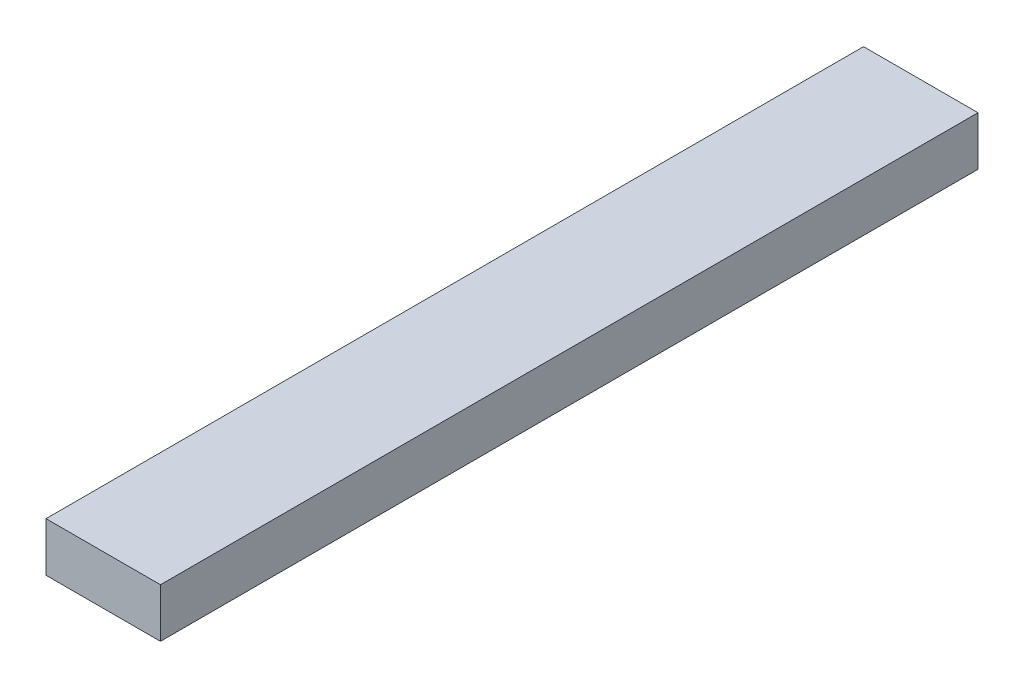
ISO-10303-21;
HEADER;
FILE_DESCRIPTION(('STEP AP214'),'2;1');
FILE_NAME('part.step','',(''),(''),'','','');
FILE_SCHEMA(('AUTOMOTIVE_DESIGN { 1 0 10303 214 1 1 1 1 }'));
ENDSEC;
DATA;
#1=APPLICATION_CONTEXT('core data for automotive mechanical design processes');
#2=APPLICATION_PROTOCOL_DEFINITION('international standard','automotive_design',2000,#1);
#3=PRODUCT_CONTEXT('',#1,'mechanical');
#4=PRODUCT('Part','Part','',(#3));
#5=PRODUCT_RELATED_PRODUCT_CATEGORY('part','',(#4));
#6=PRODUCT_DEFINITION_FORMATION('','',#4);
#7=PRODUCT_DEFINITION_CONTEXT('part definition',#1,'design');
#8=PRODUCT_DEFINITION('design','',#6,#7);
#9=PRODUCT_DEFINITION_SHAPE('','',#8);
#10=(LENGTH_UNIT() NAMED_UNIT(*) SI_UNIT(.MILLI.,.METRE.));
#11=(NAMED_UNIT(*) PLANE_ANGLE_UNIT() SI_UNIT($,.RADIAN.));
#12=(NAMED_UNIT(*) SI_UNIT($,.STERADIAN.) SOLID_ANGLE_UNIT());
#13=UNCERTAINTY_MEASURE_WITH_UNIT(LENGTH_MEASURE(1.E-05),#10,'distance_accuracy_value','');
#14=(GEOMETRIC_REPRESENTATION_CONTEXT(3) GLOBAL_UNCERTAINTY_ASSIGNED_CONTEXT((#13)) GLOBAL_UNIT_ASSIGNED_CONTEXT((#10,
#11,#12)) REPRESENTATION_CONTEXT('',''));
#15=CARTESIAN_POINT('',(0.,0.,0.));
#16=DIRECTION('',(0.,0.,1.));
#17=DIRECTION('',(1.,0.,0.));
#18=AXIS2_PLACEMENT_3D('',#15,#16,#17);
#19=CARTESIAN_POINT('',(0.,0.,635.));
#20=DIRECTION('',(1.,0.,0.));
#21=DIRECTION('',(0.,1.,0.));
#22=AXIS2_PLACEMENT_3D('',#19,#20,#21);
#23=PLANE('',#22);
#24=DIRECTION('',(0.,-1.,0.));
#25=VECTOR('',#24,1.);
#26=CARTESIAN_POINT('',(0.,0.,0.));
#27=LINE('',#26,#25);
#28=CARTESIAN_POINT('',(0.,0.,0.));
#29=VERTEX_POINT('',#28);
#30=CARTESIAN_POINT('',(0.,-38.1,0.));
#31=VERTEX_POINT('',#30);
#32=EDGE_CURVE('E96',#29,#31,#27,.T.);
#33=ORIENTED_EDGE('',*,*,#32,.T.);
#34=DIRECTION('',(0.,0.,-1.));
#35=VECTOR('',#34,1.);
#36=CARTESIAN_POINT('',(0.,-38.1,635.));
#37=LINE('',#36,#35);
#38=CARTESIAN_POINT('',(0.,-38.1,635.));
#39=VERTEX_POINT('',#38);
#40=EDGE_CURVE('E11',#39,#31,#37,.T.);
#41=ORIENTED_EDGE('',*,*,#40,.F.);
#42=DIRECTION('',(0.,-1.,0.));
#43=VECTOR('',#42,1.);
#44=CARTESIAN_POINT('',(0.,0.,635.));
#45=LINE('',#44,#43);
#46=CARTESIAN_POINT('',(0.,0.,635.));
#47=VERTEX_POINT('',#46);
#48=EDGE_CURVE('E84',#47,#39,#45,.T.);
#49=ORIENTED_EDGE('',*,*,#48,.F.);
#50=DIRECTION('',(0.,0.,-1.));
#51=VECTOR('',#50,1.);
#52=CARTESIAN_POINT('',(0.,0.,635.));
#53=LINE('',#52,#51);
#54=EDGE_CURVE('E92',#47,#29,#53,.T.);
#55=ORIENTED_EDGE('',*,*,#54,.T.);
#56=EDGE_LOOP('',(#33,#41,#49,#55));
#57=FACE_BOUND('',#56,.T.);
#58=ADVANCED_FACE('F33',(#57),#23,.F.);
#59=CARTESIAN_POINT('',(0.,-38.1,635.));
#60=DIRECTION('',(0.,1.,0.));
#61=DIRECTION('',(0.,0.,1.));
#62=AXIS2_PLACEMENT_3D('',#59,#60,#61);
#63=PLANE('',#62);
#64=DIRECTION('',(1.,0.,0.));
#65=VECTOR('',#64,1.);
#66=CARTESIAN_POINT('',(0.,-38.1,0.));
#67=LINE('',#66,#65);
#68=CARTESIAN_POINT('',(88.9,-38.1,0.));
#69=VERTEX_POINT('',#68);
#70=EDGE_CURVE('E88',#31,#69,#67,.T.);
#71=ORIENTED_EDGE('',*,*,#70,.T.);
#72=DIRECTION('',(0.,0.,-1.));
#73=VECTOR('',#72,1.);
#74=CARTESIAN_POINT('',(88.9,-38.1,635.));
#75=LINE('',#74,#73);
#76=CARTESIAN_POINT('',(88.9,-38.1,635.));
#77=VERTEX_POINT('',#76);
#78=EDGE_CURVE('E41',#77,#69,#75,.T.);
#79=ORIENTED_EDGE('',*,*,#78,.F.);
#80=DIRECTION('',(1.,0.,0.));
#81=VECTOR('',#80,1.);
#82=CARTESIAN_POINT('',(0.,-38.1,635.));
#83=LINE('',#82,#81);
#84=EDGE_CURVE('E79',#39,#77,#83,.T.);
#85=ORIENTED_EDGE('',*,*,#84,.F.);
#86=ORIENTED_EDGE('',*,*,#40,.T.);
#87=EDGE_LOOP('',(#71,#79,#85,#86));
#88=FACE_BOUND('',#87,.T.);
#89=ADVANCED_FACE('F87',(#88),#63,.F.);
#90=CARTESIAN_POINT('',(88.9,0.,635.));
#91=DIRECTION('',(-1.,0.,0.));
#92=DIRECTION('',(0.,0.,1.));
#93=AXIS2_PLACEMENT_3D('',#90,#91,#92);
#94=PLANE('',#93);
#95=DIRECTION('',(0.,1.,0.));
#96=VECTOR('',#95,1.);
#97=CARTESIAN_POINT('',(88.9,0.,0.));
#98=LINE('',#97,#96);
#99=CARTESIAN_POINT('',(88.9,0.,0.));
#100=VERTEX_POINT('',#99);
#101=EDGE_CURVE('E66',#69,#100,#98,.T.);
#102=ORIENTED_EDGE('',*,*,#101,.T.);
#103=DIRECTION('',(0.,0.,-1.));
#104=VECTOR('',#103,1.);
#105=CARTESIAN_POINT('',(88.9,0.,635.));
#106=LINE('',#105,#104);
#107=CARTESIAN_POINT('',(88.9,0.,635.));
#108=VERTEX_POINT('',#107);
#109=EDGE_CURVE('E89',#108,#100,#106,.T.);
#110=ORIENTED_EDGE('',*,*,#109,.F.);
#111=DIRECTION('',(0.,1.,0.));
#112=VECTOR('',#111,1.);
#113=CARTESIAN_POINT('',(88.9,0.,635.));
#114=LINE('',#113,#112);
#115=EDGE_CURVE('E82',#77,#108,#114,.T.);
#116=ORIENTED_EDGE('',*,*,#115,.F.);
#117=ORIENTED_EDGE('',*,*,#78,.T.);
#118=EDGE_LOOP('',(#102,#110,#116,#117));
#119=FACE_BOUND('',#118,.T.);
#120=ADVANCED_FACE('F90',(#119),#94,.F.);
#121=CARTESIAN_POINT('',(0.,0.,635.));
#122=DIRECTION('',(0.,-1.,0.));
#123=DIRECTION('',(0.,0.,-1.));
#124=AXIS2_PLACEMENT_3D('',#121,#122,#123);
#125=PLANE('',#124);
#126=DIRECTION('',(-1.,0.,0.));
#127=VECTOR('',#126,1.);
#128=CARTESIAN_POINT('',(0.,0.,0.));
#129=LINE('',#128,#127);
#130=EDGE_CURVE('E72',#100,#29,#129,.T.);
#131=ORIENTED_EDGE('',*,*,#130,.T.);
#132=ORIENTED_EDGE('',*,*,#54,.F.);
#133=DIRECTION('',(-1.,0.,0.));
#134=VECTOR('',#133,1.);
#135=CARTESIAN_POINT('',(0.,0.,635.));
#136=LINE('',#135,#134);
#137=EDGE_CURVE('E49',#108,#47,#136,.T.);
#138=ORIENTED_EDGE('',*,*,#137,.F.);
#139=ORIENTED_EDGE('',*,*,#109,.T.);
#140=EDGE_LOOP('',(#131,#132,#138,#139));
#141=FACE_BOUND('',#140,.T.);
#142=ADVANCED_FACE('F103',(#141),#125,.F.);
#143=CARTESIAN_POINT('',(0.,0.,635.));
#144=DIRECTION('',(0.,0.,1.));
#145=DIRECTION('',(1.,0.,0.));
#146=AXIS2_PLACEMENT_3D('',#143,#144,#145);
#147=PLANE('',#146);
#148=ORIENTED_EDGE('',*,*,#48,.T.);
#149=ORIENTED_EDGE('',*,*,#84,.T.);
#150=ORIENTED_EDGE('',*,*,#115,.T.);
#151=ORIENTED_EDGE('',*,*,#137,.T.);
#152=EDGE_LOOP('',(#148,#149,#150,#151));
#153=FACE_BOUND('',#152,.T.);
#154=ADVANCED_FACE('F80',(#153),#147,.T.);
#155=CARTESIAN_POINT('',(0.,0.,0.));
#156=DIRECTION('',(0.,0.,1.));
#157=DIRECTION('',(1.,0.,0.));
#158=AXIS2_PLACEMENT_3D('',#155,#156,#157);
#159=PLANE('',#158);
#160=ORIENTED_EDGE('',*,*,#32,.F.);
#161=ORIENTED_EDGE('',*,*,#130,.F.);
#162=ORIENTED_EDGE('',*,*,#101,.F.);
#163=ORIENTED_EDGE('',*,*,#70,.F.);
#164=EDGE_LOOP('',(#160,#161,#162,#163));
#165=FACE_BOUND('',#164,.T.);
#166=ADVANCED_FACE('F106',(#165),#159,.F.);
#167=CLOSED_SHELL('',(#58,#89,#120,#142,#154,#166));
#168=MANIFOLD_SOLID_BREP('B2',#167);
#169=ADVANCED_BREP_SHAPE_REPRESENTATION('',(#18,#168),#14);
#170=SHAPE_DEFINITION_REPRESENTATION(#9,#169);
ENDSEC;
END-ISO-10303-21;
